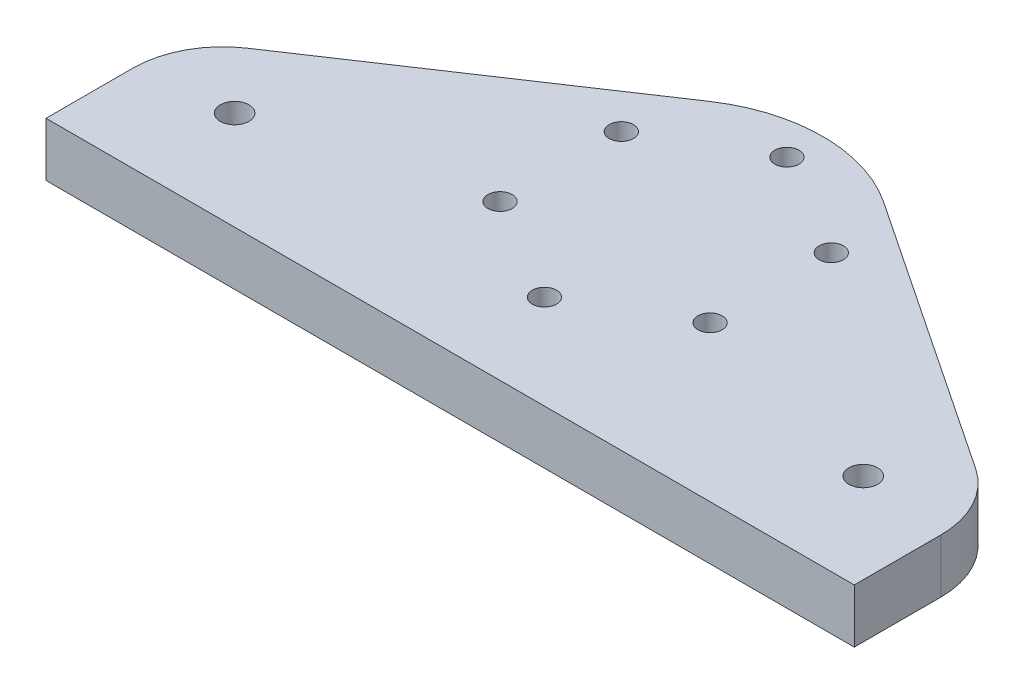
ISO-10303-21;
HEADER;
FILE_DESCRIPTION(('STEP AP214'),'2;1');
FILE_NAME('part.step','',(''),(''),'','','');
FILE_SCHEMA(('AUTOMOTIVE_DESIGN { 1 0 10303 214 1 1 1 1 }'));
ENDSEC;
DATA;
#1=APPLICATION_CONTEXT('core data for automotive mechanical design processes');
#2=APPLICATION_PROTOCOL_DEFINITION('international standard','automotive_design',2000,#1);
#3=PRODUCT_CONTEXT('',#1,'mechanical');
#4=PRODUCT('Part','Part','',(#3));
#5=PRODUCT_RELATED_PRODUCT_CATEGORY('part','',(#4));
#6=PRODUCT_DEFINITION_FORMATION('','',#4);
#7=PRODUCT_DEFINITION_CONTEXT('part definition',#1,'design');
#8=PRODUCT_DEFINITION('design','',#6,#7);
#9=PRODUCT_DEFINITION_SHAPE('','',#8);
#10=(LENGTH_UNIT() NAMED_UNIT(*) SI_UNIT(.MILLI.,.METRE.));
#11=(NAMED_UNIT(*) PLANE_ANGLE_UNIT() SI_UNIT($,.RADIAN.));
#12=(NAMED_UNIT(*) SI_UNIT($,.STERADIAN.) SOLID_ANGLE_UNIT());
#13=UNCERTAINTY_MEASURE_WITH_UNIT(LENGTH_MEASURE(1.E-05),#10,'distance_accuracy_value','');
#14=(GEOMETRIC_REPRESENTATION_CONTEXT(3) GLOBAL_UNCERTAINTY_ASSIGNED_CONTEXT((#13)) GLOBAL_UNIT_ASSIGNED_CONTEXT((#10,
#11,#12)) REPRESENTATION_CONTEXT('',''));
#15=CARTESIAN_POINT('',(0.,0.,0.));
#16=DIRECTION('',(0.,0.,1.));
#17=DIRECTION('',(1.,0.,0.));
#18=AXIS2_PLACEMENT_3D('',#15,#16,#17);
#19=CARTESIAN_POINT('',(0.,6.,0.));
#20=DIRECTION('',(0.,-1.,0.));
#21=DIRECTION('',(0.,0.,-1.));
#22=AXIS2_PLACEMENT_3D('',#19,#20,#21);
#23=CYLINDRICAL_SURFACE('',#22,17.5);
#24=CARTESIAN_POINT('',(0.,0.,0.));
#25=DIRECTION('',(0.,1.,0.));
#26=DIRECTION('',(0.,0.,1.));
#27=AXIS2_PLACEMENT_3D('',#24,#25,#26);
#28=CIRCLE('',#27,17.5);
#29=CARTESIAN_POINT('',(9.71649811361546,0.,-14.5547127902995));
#30=VERTEX_POINT('',#29);
#31=CARTESIAN_POINT('',(-9.71649811361546,0.,-14.5547127902995));
#32=VERTEX_POINT('',#31);
#33=EDGE_CURVE('E127',#30,#32,#28,.T.);
#34=ORIENTED_EDGE('',*,*,#33,.T.);
#35=DIRECTION('',(0.,-1.,0.));
#36=VECTOR('',#35,1.);
#37=CARTESIAN_POINT('',(-9.71649811361546,6.,-14.5547127902995));
#38=LINE('',#37,#36);
#39=CARTESIAN_POINT('',(-9.71649811361546,6.,-14.5547127902995));
#40=VERTEX_POINT('',#39);
#41=EDGE_CURVE('E109',#40,#32,#38,.T.);
#42=ORIENTED_EDGE('',*,*,#41,.F.);
#43=CARTESIAN_POINT('',(0.,6.,0.));
#44=DIRECTION('',(0.,1.,0.));
#45=DIRECTION('',(0.,0.,1.));
#46=AXIS2_PLACEMENT_3D('',#43,#44,#45);
#47=CIRCLE('',#46,17.5);
#48=CARTESIAN_POINT('',(9.71649811361546,6.,-14.5547127902995));
#49=VERTEX_POINT('',#48);
#50=EDGE_CURVE('E113',#49,#40,#47,.T.);
#51=ORIENTED_EDGE('',*,*,#50,.F.);
#52=DIRECTION('',(0.,-1.,0.));
#53=VECTOR('',#52,1.);
#54=CARTESIAN_POINT('',(9.71649811361546,6.,-14.5547127902995));
#55=LINE('',#54,#53);
#56=EDGE_CURVE('E184',#49,#30,#55,.T.);
#57=ORIENTED_EDGE('',*,*,#56,.T.);
#58=EDGE_LOOP('',(#34,#42,#51,#57));
#59=FACE_BOUND('',#58,.T.);
#60=ADVANCED_FACE('F42',(#59),#23,.T.);
#61=CARTESIAN_POINT('',(-9.71649811361546,6.,-14.5547127902995));
#62=DIRECTION('',(0.555228463635169,0.,0.831697873731399));
#63=DIRECTION('',(0.831697873731399,0.,-0.555228463635169));
#64=AXIS2_PLACEMENT_3D('',#61,#62,#63);
#65=PLANE('',#64);
#66=DIRECTION('',(-0.831697873731399,0.,0.555228463635169));
#67=VECTOR('',#66,1.);
#68=CARTESIAN_POINT('',(-9.71649811361546,0.,-14.5547127902995));
#69=LINE('',#68,#67);
#70=CARTESIAN_POINT('',(-40.5522846363517,0.,6.03077494118673));
#71=VERTEX_POINT('',#70);
#72=EDGE_CURVE('E170',#32,#71,#69,.T.);
#73=ORIENTED_EDGE('',*,*,#72,.T.);
#74=DIRECTION('',(0.,-1.,0.));
#75=VECTOR('',#74,1.);
#76=CARTESIAN_POINT('',(-40.5522846363517,6.,6.03077494118673));
#77=LINE('',#76,#75);
#78=CARTESIAN_POINT('',(-40.5522846363517,6.,6.03077494118673));
#79=VERTEX_POINT('',#78);
#80=EDGE_CURVE('E11',#71,#79,#77,.F.);
#81=ORIENTED_EDGE('',*,*,#80,.T.);
#82=DIRECTION('',(-0.831697873731399,0.,0.555228463635169));
#83=VECTOR('',#82,1.);
#84=CARTESIAN_POINT('',(-9.71649811361546,6.,-14.5547127902995));
#85=LINE('',#84,#83);
#86=EDGE_CURVE('E105',#40,#79,#85,.T.);
#87=ORIENTED_EDGE('',*,*,#86,.F.);
#88=ORIENTED_EDGE('',*,*,#41,.T.);
#89=EDGE_LOOP('',(#73,#81,#87,#88));
#90=FACE_BOUND('',#89,.T.);
#91=ADVANCED_FACE('F107',(#90),#65,.F.);
#92=CARTESIAN_POINT('',(-45.,6.,9.));
#93=DIRECTION('',(1.,0.,0.));
#94=DIRECTION('',(0.,0.,-1.));
#95=AXIS2_PLACEMENT_3D('',#92,#93,#94);
#96=PLANE('',#95);
#97=DIRECTION('',(0.,0.,1.));
#98=VECTOR('',#97,1.);
#99=CARTESIAN_POINT('',(-45.,6.,9.));
#100=LINE('',#99,#98);
#101=CARTESIAN_POINT('',(-45.,6.,14.3477536785007));
#102=VERTEX_POINT('',#101);
#103=CARTESIAN_POINT('',(-45.,6.,24.));
#104=VERTEX_POINT('',#103);
#105=EDGE_CURVE('E112',#102,#104,#100,.T.);
#106=ORIENTED_EDGE('',*,*,#105,.F.);
#107=DIRECTION('',(0.,-1.,0.));
#108=VECTOR('',#107,1.);
#109=CARTESIAN_POINT('',(-45.,6.,14.3477536785007));
#110=LINE('',#109,#108);
#111=CARTESIAN_POINT('',(-45.,0.,14.3477536785007));
#112=VERTEX_POINT('',#111);
#113=EDGE_CURVE('E51',#102,#112,#110,.T.);
#114=ORIENTED_EDGE('',*,*,#113,.T.);
#115=DIRECTION('',(0.,0.,1.));
#116=VECTOR('',#115,1.);
#117=CARTESIAN_POINT('',(-45.,0.,9.));
#118=LINE('',#117,#116);
#119=CARTESIAN_POINT('',(-45.,0.,24.));
#120=VERTEX_POINT('',#119);
#121=EDGE_CURVE('E161',#112,#120,#118,.T.);
#122=ORIENTED_EDGE('',*,*,#121,.T.);
#123=DIRECTION('',(0.,-1.,0.));
#124=VECTOR('',#123,1.);
#125=CARTESIAN_POINT('',(-45.,6.,24.));
#126=LINE('',#125,#124);
#127=EDGE_CURVE('E130',#104,#120,#126,.T.);
#128=ORIENTED_EDGE('',*,*,#127,.F.);
#129=EDGE_LOOP('',(#106,#114,#122,#128));
#130=FACE_BOUND('',#129,.T.);
#131=ADVANCED_FACE('F159',(#130),#96,.F.);
#132=CARTESIAN_POINT('',(-45.,6.,24.));
#133=DIRECTION('',(0.,0.,-1.));
#134=DIRECTION('',(-1.,0.,0.));
#135=AXIS2_PLACEMENT_3D('',#132,#133,#134);
#136=PLANE('',#135);
#137=DIRECTION('',(1.,0.,0.));
#138=VECTOR('',#137,1.);
#139=CARTESIAN_POINT('',(-45.,0.,24.));
#140=LINE('',#139,#138);
#141=CARTESIAN_POINT('',(45.,0.,24.));
#142=VERTEX_POINT('',#141);
#143=EDGE_CURVE('E168',#120,#142,#140,.T.);
#144=ORIENTED_EDGE('',*,*,#143,.T.);
#145=DIRECTION('',(0.,-1.,0.));
#146=VECTOR('',#145,1.);
#147=CARTESIAN_POINT('',(45.,6.,24.));
#148=LINE('',#147,#146);
#149=CARTESIAN_POINT('',(45.,6.,24.));
#150=VERTEX_POINT('',#149);
#151=EDGE_CURVE('E138',#150,#142,#148,.T.);
#152=ORIENTED_EDGE('',*,*,#151,.F.);
#153=DIRECTION('',(1.,0.,0.));
#154=VECTOR('',#153,1.);
#155=CARTESIAN_POINT('',(-45.,6.,24.));
#156=LINE('',#155,#154);
#157=EDGE_CURVE('E205',#104,#150,#156,.T.);
#158=ORIENTED_EDGE('',*,*,#157,.F.);
#159=ORIENTED_EDGE('',*,*,#127,.T.);
#160=EDGE_LOOP('',(#144,#152,#158,#159));
#161=FACE_BOUND('',#160,.T.);
#162=ADVANCED_FACE('F264',(#161),#136,.F.);
#163=CARTESIAN_POINT('',(45.,6.,24.));
#164=DIRECTION('',(-1.,0.,0.));
#165=DIRECTION('',(0.,0.,1.));
#166=AXIS2_PLACEMENT_3D('',#163,#164,#165);
#167=PLANE('',#166);
#168=DIRECTION('',(0.,0.,-1.));
#169=VECTOR('',#168,1.);
#170=CARTESIAN_POINT('',(45.,0.,24.));
#171=LINE('',#170,#169);
#172=CARTESIAN_POINT('',(45.,0.,14.3477536785007));
#173=VERTEX_POINT('',#172);
#174=EDGE_CURVE('E174',#142,#173,#171,.T.);
#175=ORIENTED_EDGE('',*,*,#174,.T.);
#176=DIRECTION('',(0.,-1.,0.));
#177=VECTOR('',#176,1.);
#178=CARTESIAN_POINT('',(45.,6.,14.3477536785007));
#179=LINE('',#178,#177);
#180=CARTESIAN_POINT('',(45.,6.,14.3477536785007));
#181=VERTEX_POINT('',#180);
#182=EDGE_CURVE('E147',#173,#181,#179,.F.);
#183=ORIENTED_EDGE('',*,*,#182,.T.);
#184=DIRECTION('',(0.,0.,-1.));
#185=VECTOR('',#184,1.);
#186=CARTESIAN_POINT('',(45.,6.,24.));
#187=LINE('',#186,#185);
#188=EDGE_CURVE('E193',#150,#181,#187,.T.);
#189=ORIENTED_EDGE('',*,*,#188,.F.);
#190=ORIENTED_EDGE('',*,*,#151,.T.);
#191=EDGE_LOOP('',(#175,#183,#189,#190));
#192=FACE_BOUND('',#191,.T.);
#193=ADVANCED_FACE('F191',(#192),#167,.F.);
#194=CARTESIAN_POINT('',(45.,6.,9.));
#195=DIRECTION('',(-0.555228463635169,0.,0.831697873731399));
#196=DIRECTION('',(0.831697873731399,0.,0.555228463635169));
#197=AXIS2_PLACEMENT_3D('',#194,#195,#196);
#198=PLANE('',#197);
#199=DIRECTION('',(-0.831697873731399,0.,-0.555228463635169));
#200=VECTOR('',#199,1.);
#201=CARTESIAN_POINT('',(45.,6.,9.));
#202=LINE('',#201,#200);
#203=CARTESIAN_POINT('',(40.5522846363517,6.,6.03077494118673));
#204=VERTEX_POINT('',#203);
#205=EDGE_CURVE('E119',#204,#49,#202,.T.);
#206=ORIENTED_EDGE('',*,*,#205,.F.);
#207=DIRECTION('',(0.,-1.,0.));
#208=VECTOR('',#207,1.);
#209=CARTESIAN_POINT('',(40.5522846363517,6.,6.03077494118673));
#210=LINE('',#209,#208);
#211=CARTESIAN_POINT('',(40.5522846363517,0.,6.03077494118673));
#212=VERTEX_POINT('',#211);
#213=EDGE_CURVE('E129',#204,#212,#210,.T.);
#214=ORIENTED_EDGE('',*,*,#213,.T.);
#215=DIRECTION('',(-0.831697873731399,0.,-0.555228463635169));
#216=VECTOR('',#215,1.);
#217=CARTESIAN_POINT('',(45.,0.,9.));
#218=LINE('',#217,#216);
#219=EDGE_CURVE('E124',#212,#30,#218,.T.);
#220=ORIENTED_EDGE('',*,*,#219,.T.);
#221=ORIENTED_EDGE('',*,*,#56,.F.);
#222=EDGE_LOOP('',(#206,#214,#220,#221));
#223=FACE_BOUND('',#222,.T.);
#224=ADVANCED_FACE('F201',(#223),#198,.F.);
#225=CARTESIAN_POINT('',(0.,6.,0.));
#226=DIRECTION('',(0.,1.,0.));
#227=DIRECTION('',(0.,0.,1.));
#228=AXIS2_PLACEMENT_3D('',#225,#226,#227);
#229=PLANE('',#228);
#230=CARTESIAN_POINT('',(-35.,6.,13.));
#231=DIRECTION('',(0.,1.,0.));
#232=DIRECTION('',(0.,0.,1.));
#233=AXIS2_PLACEMENT_3D('',#230,#231,#232);
#234=CIRCLE('',#233,1.6);
#235=CARTESIAN_POINT('',(-35.,6.,14.6));
#236=VERTEX_POINT('',#235);
#237=EDGE_CURVE('E227',#236,#236,#234,.F.);
#238=ORIENTED_EDGE('',*,*,#237,.T.);
#239=EDGE_LOOP('',(#238));
#240=FACE_BOUND('',#239,.T.);
#241=CARTESIAN_POINT('',(35.,6.,13.));
#242=DIRECTION('',(0.,1.,0.));
#243=DIRECTION('',(0.,0.,1.));
#244=AXIS2_PLACEMENT_3D('',#241,#242,#243);
#245=CIRCLE('',#244,1.6);
#246=CARTESIAN_POINT('',(35.,6.,14.6));
#247=VERTEX_POINT('',#246);
#248=EDGE_CURVE('E464',#247,#247,#245,.F.);
#249=ORIENTED_EDGE('',*,*,#248,.T.);
#250=EDGE_LOOP('',(#249));
#251=FACE_BOUND('',#250,.T.);
#252=CARTESIAN_POINT('',(0.,6.,-13.5));
#253=DIRECTION('',(0.,1.,0.));
#254=DIRECTION('',(0.,0.,1.));
#255=AXIS2_PLACEMENT_3D('',#252,#253,#254);
#256=CIRCLE('',#255,1.35);
#257=CARTESIAN_POINT('',(0.,6.,-12.15));
#258=VERTEX_POINT('',#257);
#259=EDGE_CURVE('E212',#258,#258,#256,.T.);
#260=ORIENTED_EDGE('',*,*,#259,.F.);
#261=EDGE_LOOP('',(#260));
#262=FACE_BOUND('',#261,.T.);
#263=CARTESIAN_POINT('',(-11.6913429510899,6.,-6.74999999999999));
#264=DIRECTION('',(0.,1.,0.));
#265=DIRECTION('',(0.,0.,1.));
#266=AXIS2_PLACEMENT_3D('',#263,#264,#265);
#267=CIRCLE('',#266,1.35);
#268=CARTESIAN_POINT('',(-11.6913429510899,6.,-5.39999999999999));
#269=VERTEX_POINT('',#268);
#270=EDGE_CURVE('E226',#269,#269,#267,.T.);
#271=ORIENTED_EDGE('',*,*,#270,.F.);
#272=EDGE_LOOP('',(#271));
#273=FACE_BOUND('',#272,.T.);
#274=CARTESIAN_POINT('',(-11.6913429510899,6.,6.75000000000001));
#275=DIRECTION('',(0.,1.,0.));
#276=DIRECTION('',(0.,0.,1.));
#277=AXIS2_PLACEMENT_3D('',#274,#275,#276);
#278=CIRCLE('',#277,1.35);
#279=CARTESIAN_POINT('',(-11.6913429510899,6.,8.1));
#280=VERTEX_POINT('',#279);
#281=EDGE_CURVE('E252',#280,#280,#278,.T.);
#282=ORIENTED_EDGE('',*,*,#281,.F.);
#283=EDGE_LOOP('',(#282));
#284=FACE_BOUND('',#283,.T.);
#285=CARTESIAN_POINT('',(0.,6.,13.5));
#286=DIRECTION('',(0.,1.,0.));
#287=DIRECTION('',(0.,0.,1.));
#288=AXIS2_PLACEMENT_3D('',#285,#286,#287);
#289=CIRCLE('',#288,1.35);
#290=CARTESIAN_POINT('',(0.,6.,14.85));
#291=VERTEX_POINT('',#290);
#292=EDGE_CURVE('E244',#291,#291,#289,.T.);
#293=ORIENTED_EDGE('',*,*,#292,.F.);
#294=EDGE_LOOP('',(#293));
#295=FACE_BOUND('',#294,.T.);
#296=CARTESIAN_POINT('',(11.6913429510899,6.,6.75));
#297=DIRECTION('',(0.,1.,0.));
#298=DIRECTION('',(0.,0.,1.));
#299=AXIS2_PLACEMENT_3D('',#296,#297,#298);
#300=CIRCLE('',#299,1.35);
#301=CARTESIAN_POINT('',(11.6913429510899,6.,8.1));
#302=VERTEX_POINT('',#301);
#303=EDGE_CURVE('E236',#302,#302,#300,.T.);
#304=ORIENTED_EDGE('',*,*,#303,.F.);
#305=EDGE_LOOP('',(#304));
#306=FACE_BOUND('',#305,.T.);
#307=CARTESIAN_POINT('',(11.6913429510899,6.,-6.75));
#308=DIRECTION('',(0.,1.,0.));
#309=DIRECTION('',(0.,0.,1.));
#310=AXIS2_PLACEMENT_3D('',#307,#308,#309);
#311=CIRCLE('',#310,1.35);
#312=CARTESIAN_POINT('',(11.6913429510899,6.,-5.4));
#313=VERTEX_POINT('',#312);
#314=EDGE_CURVE('E218',#313,#313,#311,.T.);
#315=ORIENTED_EDGE('',*,*,#314,.F.);
#316=EDGE_LOOP('',(#315));
#317=FACE_BOUND('',#316,.T.);
#318=ORIENTED_EDGE('',*,*,#188,.T.);
#319=CARTESIAN_POINT('',(35.,6.,14.3477536785007));
#320=DIRECTION('',(0.,1.,0.));
#321=DIRECTION('',(0.,0.,1.));
#322=AXIS2_PLACEMENT_3D('',#319,#320,#321);
#323=CIRCLE('',#322,10.);
#324=EDGE_CURVE('E152',#181,#204,#323,.T.);
#325=ORIENTED_EDGE('',*,*,#324,.T.);
#326=ORIENTED_EDGE('',*,*,#205,.T.);
#327=ORIENTED_EDGE('',*,*,#50,.T.);
#328=ORIENTED_EDGE('',*,*,#86,.T.);
#329=CARTESIAN_POINT('',(-35.,6.,14.3477536785007));
#330=DIRECTION('',(0.,1.,0.));
#331=DIRECTION('',(0.,0.,1.));
#332=AXIS2_PLACEMENT_3D('',#329,#330,#331);
#333=CIRCLE('',#332,10.);
#334=EDGE_CURVE('E58',#79,#102,#333,.T.);
#335=ORIENTED_EDGE('',*,*,#334,.T.);
#336=ORIENTED_EDGE('',*,*,#105,.T.);
#337=ORIENTED_EDGE('',*,*,#157,.T.);
#338=EDGE_LOOP('',(#318,#325,#326,#327,#328,#335,#336,#337));
#339=FACE_BOUND('',#338,.T.);
#340=ADVANCED_FACE('F117',(#240,#251,#262,#273,#284,#295,#306,#317,#339),#229,.T.);
#341=CARTESIAN_POINT('',(0.,0.,0.));
#342=DIRECTION('',(0.,1.,0.));
#343=DIRECTION('',(0.,0.,1.));
#344=AXIS2_PLACEMENT_3D('',#341,#342,#343);
#345=PLANE('',#344);
#346=CARTESIAN_POINT('',(-35.,0.,13.));
#347=DIRECTION('',(0.,-1.,0.));
#348=DIRECTION('',(0.,0.,-1.));
#349=AXIS2_PLACEMENT_3D('',#346,#347,#348);
#350=CIRCLE('',#349,1.6);
#351=CARTESIAN_POINT('',(-35.,0.,11.4));
#352=VERTEX_POINT('',#351);
#353=EDGE_CURVE('E455',#352,#352,#350,.T.);
#354=ORIENTED_EDGE('',*,*,#353,.F.);
#355=EDGE_LOOP('',(#354));
#356=FACE_BOUND('',#355,.T.);
#357=CARTESIAN_POINT('',(35.,0.,13.));
#358=DIRECTION('',(0.,-1.,0.));
#359=DIRECTION('',(0.,0.,1.));
#360=AXIS2_PLACEMENT_3D('',#357,#358,#359);
#361=CIRCLE('',#360,1.6);
#362=CARTESIAN_POINT('',(35.,0.,14.6));
#363=VERTEX_POINT('',#362);
#364=EDGE_CURVE('E461',#363,#363,#361,.T.);
#365=ORIENTED_EDGE('',*,*,#364,.F.);
#366=EDGE_LOOP('',(#365));
#367=FACE_BOUND('',#366,.T.);
#368=CARTESIAN_POINT('',(0.,0.,-13.5));
#369=DIRECTION('',(0.,1.,0.));
#370=DIRECTION('',(0.,0.,1.));
#371=AXIS2_PLACEMENT_3D('',#368,#369,#370);
#372=CIRCLE('',#371,1.35);
#373=CARTESIAN_POINT('',(0.,0.,-12.15));
#374=VERTEX_POINT('',#373);
#375=EDGE_CURVE('E209',#374,#374,#372,.F.);
#376=ORIENTED_EDGE('',*,*,#375,.F.);
#377=EDGE_LOOP('',(#376));
#378=FACE_BOUND('',#377,.T.);
#379=CARTESIAN_POINT('',(-11.6913429510899,0.,-6.74999999999999));
#380=DIRECTION('',(0.,1.,0.));
#381=DIRECTION('',(0.,0.,1.));
#382=AXIS2_PLACEMENT_3D('',#379,#380,#381);
#383=CIRCLE('',#382,1.35);
#384=CARTESIAN_POINT('',(-11.6913429510899,0.,-5.39999999999999));
#385=VERTEX_POINT('',#384);
#386=EDGE_CURVE('E222',#385,#385,#383,.F.);
#387=ORIENTED_EDGE('',*,*,#386,.F.);
#388=EDGE_LOOP('',(#387));
#389=FACE_BOUND('',#388,.T.);
#390=CARTESIAN_POINT('',(-11.6913429510899,0.,6.75000000000001));
#391=DIRECTION('',(0.,1.,0.));
#392=DIRECTION('',(0.,0.,1.));
#393=AXIS2_PLACEMENT_3D('',#390,#391,#392);
#394=CIRCLE('',#393,1.35);
#395=CARTESIAN_POINT('',(-11.6913429510899,0.,8.1));
#396=VERTEX_POINT('',#395);
#397=EDGE_CURVE('E231',#396,#396,#394,.F.);
#398=ORIENTED_EDGE('',*,*,#397,.F.);
#399=EDGE_LOOP('',(#398));
#400=FACE_BOUND('',#399,.T.);
#401=CARTESIAN_POINT('',(0.,0.,13.5));
#402=DIRECTION('',(0.,1.,0.));
#403=DIRECTION('',(0.,0.,1.));
#404=AXIS2_PLACEMENT_3D('',#401,#402,#403);
#405=CIRCLE('',#404,1.35);
#406=CARTESIAN_POINT('',(0.,0.,14.85));
#407=VERTEX_POINT('',#406);
#408=EDGE_CURVE('E248',#407,#407,#405,.F.);
#409=ORIENTED_EDGE('',*,*,#408,.F.);
#410=EDGE_LOOP('',(#409));
#411=FACE_BOUND('',#410,.T.);
#412=CARTESIAN_POINT('',(11.6913429510899,0.,6.75));
#413=DIRECTION('',(0.,1.,0.));
#414=DIRECTION('',(0.,0.,1.));
#415=AXIS2_PLACEMENT_3D('',#412,#413,#414);
#416=CIRCLE('',#415,1.35);
#417=CARTESIAN_POINT('',(11.6913429510899,0.,8.1));
#418=VERTEX_POINT('',#417);
#419=EDGE_CURVE('E240',#418,#418,#416,.F.);
#420=ORIENTED_EDGE('',*,*,#419,.F.);
#421=EDGE_LOOP('',(#420));
#422=FACE_BOUND('',#421,.T.);
#423=CARTESIAN_POINT('',(11.6913429510899,0.,-6.75));
#424=DIRECTION('',(0.,1.,0.));
#425=DIRECTION('',(0.,0.,1.));
#426=AXIS2_PLACEMENT_3D('',#423,#424,#425);
#427=CIRCLE('',#426,1.35);
#428=CARTESIAN_POINT('',(11.6913429510899,0.,-5.4));
#429=VERTEX_POINT('',#428);
#430=EDGE_CURVE('E232',#429,#429,#427,.F.);
#431=ORIENTED_EDGE('',*,*,#430,.F.);
#432=EDGE_LOOP('',(#431));
#433=FACE_BOUND('',#432,.T.);
#434=ORIENTED_EDGE('',*,*,#219,.F.);
#435=CARTESIAN_POINT('',(35.,0.,14.3477536785007));
#436=DIRECTION('',(0.,1.,0.));
#437=DIRECTION('',(0.,0.,1.));
#438=AXIS2_PLACEMENT_3D('',#435,#436,#437);
#439=CIRCLE('',#438,10.);
#440=EDGE_CURVE('E144',#212,#173,#439,.F.);
#441=ORIENTED_EDGE('',*,*,#440,.T.);
#442=ORIENTED_EDGE('',*,*,#174,.F.);
#443=ORIENTED_EDGE('',*,*,#143,.F.);
#444=ORIENTED_EDGE('',*,*,#121,.F.);
#445=CARTESIAN_POINT('',(-35.,0.,14.3477536785007));
#446=DIRECTION('',(0.,1.,0.));
#447=DIRECTION('',(0.,0.,1.));
#448=AXIS2_PLACEMENT_3D('',#445,#446,#447);
#449=CIRCLE('',#448,10.);
#450=EDGE_CURVE('E135',#112,#71,#449,.F.);
#451=ORIENTED_EDGE('',*,*,#450,.T.);
#452=ORIENTED_EDGE('',*,*,#72,.F.);
#453=ORIENTED_EDGE('',*,*,#33,.F.);
#454=EDGE_LOOP('',(#434,#441,#442,#443,#444,#451,#452,#453));
#455=FACE_BOUND('',#454,.T.);
#456=ADVANCED_FACE('F166',(#356,#367,#378,#389,#400,#411,#422,#433,#455),#345,.F.);
#457=CARTESIAN_POINT('',(11.6913429510899,-3.81837661840736,-6.75));
#458=DIRECTION('',(0.,1.,0.));
#459=DIRECTION('',(0.,0.,1.));
#460=AXIS2_PLACEMENT_3D('',#457,#458,#459);
#461=CYLINDRICAL_SURFACE('',#460,1.35);
#462=ORIENTED_EDGE('',*,*,#430,.T.);
#463=EDGE_LOOP('',(#462));
#464=FACE_BOUND('',#463,.T.);
#465=ORIENTED_EDGE('',*,*,#314,.T.);
#466=EDGE_LOOP('',(#465));
#467=FACE_BOUND('',#466,.T.);
#468=ADVANCED_FACE('F298',(#464,#467),#461,.F.);
#469=CARTESIAN_POINT('',(11.6913429510899,-3.81837661840736,6.75));
#470=DIRECTION('',(0.,1.,0.));
#471=DIRECTION('',(0.,0.,1.));
#472=AXIS2_PLACEMENT_3D('',#469,#470,#471);
#473=CYLINDRICAL_SURFACE('',#472,1.35);
#474=ORIENTED_EDGE('',*,*,#419,.T.);
#475=EDGE_LOOP('',(#474));
#476=FACE_BOUND('',#475,.T.);
#477=ORIENTED_EDGE('',*,*,#303,.T.);
#478=EDGE_LOOP('',(#477));
#479=FACE_BOUND('',#478,.T.);
#480=ADVANCED_FACE('F301',(#476,#479),#473,.F.);
#481=CARTESIAN_POINT('',(0.,-3.81837661840736,13.5));
#482=DIRECTION('',(0.,1.,0.));
#483=DIRECTION('',(0.,0.,1.));
#484=AXIS2_PLACEMENT_3D('',#481,#482,#483);
#485=CYLINDRICAL_SURFACE('',#484,1.35);
#486=ORIENTED_EDGE('',*,*,#408,.T.);
#487=EDGE_LOOP('',(#486));
#488=FACE_BOUND('',#487,.T.);
#489=ORIENTED_EDGE('',*,*,#292,.T.);
#490=EDGE_LOOP('',(#489));
#491=FACE_BOUND('',#490,.T.);
#492=ADVANCED_FACE('F305',(#488,#491),#485,.F.);
#493=CARTESIAN_POINT('',(-11.6913429510899,-3.81837661840736,6.75000000000001));
#494=DIRECTION('',(0.,1.,0.));
#495=DIRECTION('',(0.,0.,1.));
#496=AXIS2_PLACEMENT_3D('',#493,#494,#495);
#497=CYLINDRICAL_SURFACE('',#496,1.35);
#498=ORIENTED_EDGE('',*,*,#397,.T.);
#499=EDGE_LOOP('',(#498));
#500=FACE_BOUND('',#499,.T.);
#501=ORIENTED_EDGE('',*,*,#281,.T.);
#502=EDGE_LOOP('',(#501));
#503=FACE_BOUND('',#502,.T.);
#504=ADVANCED_FACE('F291',(#500,#503),#497,.F.);
#505=CARTESIAN_POINT('',(-11.6913429510899,-3.81837661840736,-6.74999999999999));
#506=DIRECTION('',(0.,1.,0.));
#507=DIRECTION('',(0.,0.,1.));
#508=AXIS2_PLACEMENT_3D('',#505,#506,#507);
#509=CYLINDRICAL_SURFACE('',#508,1.35);
#510=ORIENTED_EDGE('',*,*,#386,.T.);
#511=EDGE_LOOP('',(#510));
#512=FACE_BOUND('',#511,.T.);
#513=ORIENTED_EDGE('',*,*,#270,.T.);
#514=EDGE_LOOP('',(#513));
#515=FACE_BOUND('',#514,.T.);
#516=ADVANCED_FACE('F286',(#512,#515),#509,.F.);
#517=CARTESIAN_POINT('',(0.,-3.81837661840736,-13.5));
#518=DIRECTION('',(0.,1.,0.));
#519=DIRECTION('',(0.,0.,1.));
#520=AXIS2_PLACEMENT_3D('',#517,#518,#519);
#521=CYLINDRICAL_SURFACE('',#520,1.35);
#522=ORIENTED_EDGE('',*,*,#375,.T.);
#523=EDGE_LOOP('',(#522));
#524=FACE_BOUND('',#523,.T.);
#525=ORIENTED_EDGE('',*,*,#259,.T.);
#526=EDGE_LOOP('',(#525));
#527=FACE_BOUND('',#526,.T.);
#528=ADVANCED_FACE('F280',(#524,#527),#521,.F.);
#529=CARTESIAN_POINT('',(35.,6.,14.3477536785007));
#530=DIRECTION('',(0.,-1.,0.));
#531=DIRECTION('',(0.,0.,-1.));
#532=AXIS2_PLACEMENT_3D('',#529,#530,#531);
#533=CYLINDRICAL_SURFACE('',#532,10.);
#534=ORIENTED_EDGE('',*,*,#324,.F.);
#535=ORIENTED_EDGE('',*,*,#182,.F.);
#536=ORIENTED_EDGE('',*,*,#440,.F.);
#537=ORIENTED_EDGE('',*,*,#213,.F.);
#538=EDGE_LOOP('',(#534,#535,#536,#537));
#539=FACE_BOUND('',#538,.T.);
#540=ADVANCED_FACE('F199',(#539),#533,.T.);
#541=CARTESIAN_POINT('',(-35.,6.,14.3477536785007));
#542=DIRECTION('',(0.,-1.,0.));
#543=DIRECTION('',(0.,0.,-1.));
#544=AXIS2_PLACEMENT_3D('',#541,#542,#543);
#545=CYLINDRICAL_SURFACE('',#544,10.);
#546=ORIENTED_EDGE('',*,*,#334,.F.);
#547=ORIENTED_EDGE('',*,*,#80,.F.);
#548=ORIENTED_EDGE('',*,*,#450,.F.);
#549=ORIENTED_EDGE('',*,*,#113,.F.);
#550=EDGE_LOOP('',(#546,#547,#548,#549));
#551=FACE_BOUND('',#550,.T.);
#552=ADVANCED_FACE('F44',(#551),#545,.T.);
#553=CARTESIAN_POINT('',(35.,10.5254833995939,13.));
#554=DIRECTION('',(0.,-1.,0.));
#555=DIRECTION('',(0.,0.,-1.));
#556=AXIS2_PLACEMENT_3D('',#553,#554,#555);
#557=CYLINDRICAL_SURFACE('',#556,1.6);
#558=ORIENTED_EDGE('',*,*,#364,.T.);
#559=EDGE_LOOP('',(#558));
#560=FACE_BOUND('',#559,.T.);
#561=ORIENTED_EDGE('',*,*,#248,.F.);
#562=EDGE_LOOP('',(#561));
#563=FACE_BOUND('',#562,.T.);
#564=ADVANCED_FACE('F285',(#560,#563),#557,.F.);
#565=CARTESIAN_POINT('',(-35.,10.5254833995939,13.));
#566=DIRECTION('',(0.,-1.,0.));
#567=DIRECTION('',(0.,0.,-1.));
#568=AXIS2_PLACEMENT_3D('',#565,#566,#567);
#569=CYLINDRICAL_SURFACE('',#568,1.6);
#570=ORIENTED_EDGE('',*,*,#353,.T.);
#571=EDGE_LOOP('',(#570));
#572=FACE_BOUND('',#571,.T.);
#573=ORIENTED_EDGE('',*,*,#237,.F.);
#574=EDGE_LOOP('',(#573));
#575=FACE_BOUND('',#574,.T.);
#576=ADVANCED_FACE('F434',(#572,#575),#569,.F.);
#577=CLOSED_SHELL('',(#60,#91,#131,#162,#193,#224,#340,#456,#468,#480,#492,#504,#516,#528,#540,
#552,#564,#576));
#578=MANIFOLD_SOLID_BREP('B2',#577);
#579=ADVANCED_BREP_SHAPE_REPRESENTATION('',(#18,#578),#14);
#580=SHAPE_DEFINITION_REPRESENTATION(#9,#579);
ENDSEC;
END-ISO-10303-21;
